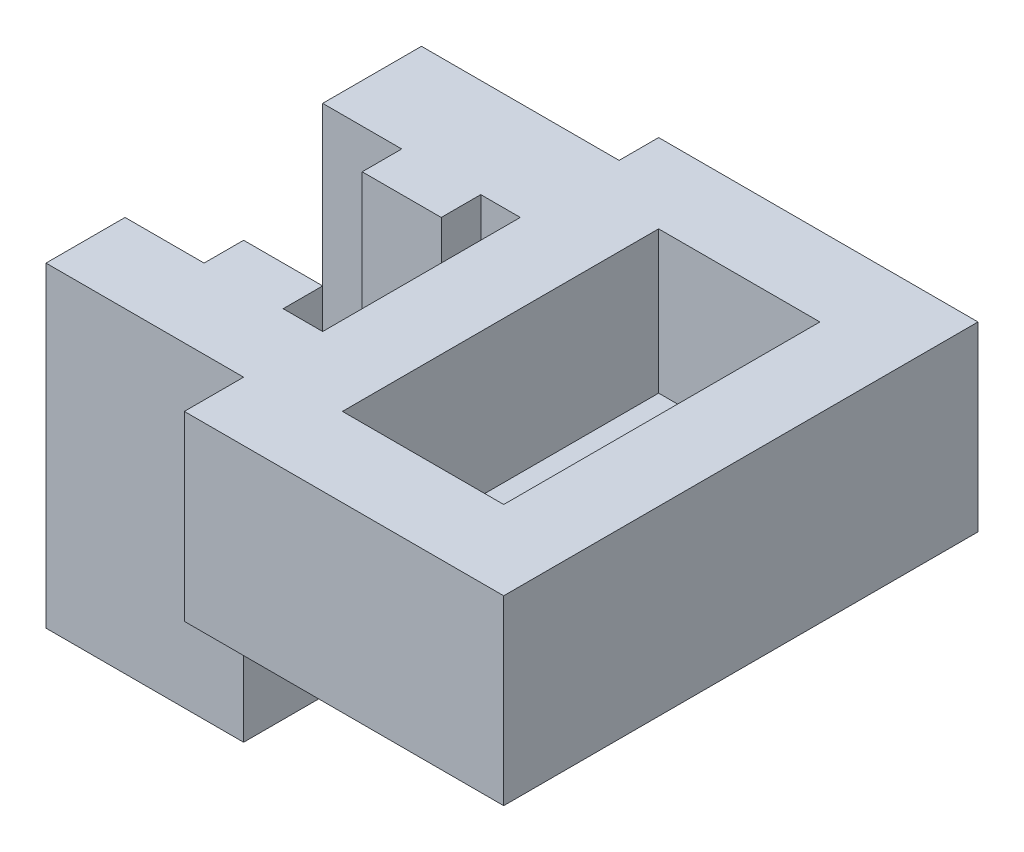
ISO-10303-21;
HEADER;
FILE_DESCRIPTION(('STEP AP214'),'2;1');
FILE_NAME('part.step','',(''),(''),'','','');
FILE_SCHEMA(('AUTOMOTIVE_DESIGN { 1 0 10303 214 1 1 1 1 }'));
ENDSEC;
DATA;
#1=APPLICATION_CONTEXT('core data for automotive mechanical design processes');
#2=APPLICATION_PROTOCOL_DEFINITION('international standard','automotive_design',2000,#1);
#3=PRODUCT_CONTEXT('',#1,'mechanical');
#4=PRODUCT('Part','Part','',(#3));
#5=PRODUCT_RELATED_PRODUCT_CATEGORY('part','',(#4));
#6=PRODUCT_DEFINITION_FORMATION('','',#4);
#7=PRODUCT_DEFINITION_CONTEXT('part definition',#1,'design');
#8=PRODUCT_DEFINITION('design','',#6,#7);
#9=PRODUCT_DEFINITION_SHAPE('','',#8);
#10=(LENGTH_UNIT() NAMED_UNIT(*) SI_UNIT(.MILLI.,.METRE.));
#11=(NAMED_UNIT(*) PLANE_ANGLE_UNIT() SI_UNIT($,.RADIAN.));
#12=(NAMED_UNIT(*) SI_UNIT($,.STERADIAN.) SOLID_ANGLE_UNIT());
#13=UNCERTAINTY_MEASURE_WITH_UNIT(LENGTH_MEASURE(1.E-05),#10,'distance_accuracy_value','');
#14=(GEOMETRIC_REPRESENTATION_CONTEXT(3) GLOBAL_UNCERTAINTY_ASSIGNED_CONTEXT((#13)) GLOBAL_UNIT_ASSIGNED_CONTEXT((#10,
#11,#12)) REPRESENTATION_CONTEXT('',''));
#15=CARTESIAN_POINT('',(0.,0.,0.));
#16=DIRECTION('',(0.,0.,1.));
#17=DIRECTION('',(1.,0.,0.));
#18=AXIS2_PLACEMENT_3D('',#15,#16,#17);
#19=CARTESIAN_POINT('',(-20.2,18.,-30.));
#20=DIRECTION('',(1.,0.,0.));
#21=DIRECTION('',(0.,0.,1.));
#22=AXIS2_PLACEMENT_3D('',#19,#20,#21);
#23=PLANE('',#22);
#24=DIRECTION('',(0.,1.,0.));
#25=VECTOR('',#24,1.);
#26=CARTESIAN_POINT('',(-20.2,-22.,12.5));
#27=LINE('',#26,#25);
#28=CARTESIAN_POINT('',(-20.2,-5.,12.5));
#29=VERTEX_POINT('',#28);
#30=CARTESIAN_POINT('',(-20.2,18.,12.5));
#31=VERTEX_POINT('',#30);
#32=EDGE_CURVE('E291',#29,#31,#27,.T.);
#33=ORIENTED_EDGE('',*,*,#32,.T.);
#34=DIRECTION('',(0.,0.,-1.));
#35=VECTOR('',#34,1.);
#36=CARTESIAN_POINT('',(-20.2,18.,-30.));
#37=LINE('',#36,#35);
#38=CARTESIAN_POINT('',(-20.2,18.,-12.5));
#39=VERTEX_POINT('',#38);
#40=EDGE_CURVE('E399',#31,#39,#37,.T.);
#41=ORIENTED_EDGE('',*,*,#40,.T.);
#42=DIRECTION('',(0.,1.,0.));
#43=VECTOR('',#42,1.);
#44=CARTESIAN_POINT('',(-20.2,-22.,-12.5));
#45=LINE('',#44,#43);
#46=CARTESIAN_POINT('',(-20.2,-5.,-12.5));
#47=VERTEX_POINT('',#46);
#48=EDGE_CURVE('E316',#47,#39,#45,.T.);
#49=ORIENTED_EDGE('',*,*,#48,.F.);
#50=DIRECTION('',(0.,0.,1.));
#51=VECTOR('',#50,1.);
#52=CARTESIAN_POINT('',(-20.2,-5.,30.));
#53=LINE('',#52,#51);
#54=EDGE_CURVE('E508',#47,#29,#53,.T.);
#55=ORIENTED_EDGE('',*,*,#54,.T.);
#56=EDGE_LOOP('',(#33,#41,#49,#55));
#57=FACE_BOUND('',#56,.T.);
#58=ADVANCED_FACE('F41',(#57),#23,.F.);
#59=CARTESIAN_POINT('',(-20.2,18.,-25.));
#60=VERTEX_POINT('',#59);
#61=CARTESIAN_POINT('',(-20.2,18.,-30.));
#62=VERTEX_POINT('',#61);
#63=EDGE_CURVE('E394',#60,#62,#37,.T.);
#64=ORIENTED_EDGE('',*,*,#63,.T.);
#65=DIRECTION('',(0.,-1.,0.));
#66=VECTOR('',#65,1.);
#67=CARTESIAN_POINT('',(-20.2,18.,-30.));
#68=LINE('',#67,#66);
#69=CARTESIAN_POINT('',(-20.2,-5.,-30.));
#70=VERTEX_POINT('',#69);
#71=EDGE_CURVE('E405',#62,#70,#68,.T.);
#72=ORIENTED_EDGE('',*,*,#71,.T.);
#73=CARTESIAN_POINT('',(-20.2,-5.,-25.));
#74=VERTEX_POINT('',#73);
#75=EDGE_CURVE('E342',#70,#74,#53,.T.);
#76=ORIENTED_EDGE('',*,*,#75,.T.);
#77=DIRECTION('',(0.,1.,0.));
#78=VECTOR('',#77,1.);
#79=CARTESIAN_POINT('',(-20.2,18.,-25.));
#80=LINE('',#79,#78);
#81=EDGE_CURVE('E223',#74,#60,#80,.T.);
#82=ORIENTED_EDGE('',*,*,#81,.T.);
#83=EDGE_LOOP('',(#64,#72,#76,#82));
#84=FACE_BOUND('',#83,.T.);
#85=ADVANCED_FACE('F447',(#84),#23,.F.);
#86=CARTESIAN_POINT('',(0.,18.,0.));
#87=DIRECTION('',(0.,1.,0.));
#88=DIRECTION('',(0.,0.,-1.));
#89=AXIS2_PLACEMENT_3D('',#86,#87,#88);
#90=PLANE('',#89);
#91=DIRECTION('',(-1.,0.,0.));
#92=VECTOR('',#91,1.);
#93=CARTESIAN_POINT('',(-45.2,18.,-25.));
#94=LINE('',#93,#92);
#95=CARTESIAN_POINT('',(-45.2,18.,-25.));
#96=VERTEX_POINT('',#95);
#97=EDGE_CURVE('E56',#60,#96,#94,.T.);
#98=ORIENTED_EDGE('',*,*,#97,.T.);
#99=DIRECTION('',(0.,0.,-1.));
#100=VECTOR('',#99,1.);
#101=CARTESIAN_POINT('',(-45.2,18.,-22.5));
#102=LINE('',#101,#100);
#103=CARTESIAN_POINT('',(-45.2,18.,-12.5));
#104=VERTEX_POINT('',#103);
#105=EDGE_CURVE('E237',#104,#96,#102,.T.);
#106=ORIENTED_EDGE('',*,*,#105,.F.);
#107=DIRECTION('',(-1.,0.,0.));
#108=VECTOR('',#107,1.);
#109=CARTESIAN_POINT('',(-45.2,18.,-12.5));
#110=LINE('',#109,#108);
#111=CARTESIAN_POINT('',(-35.2,18.,-12.5));
#112=VERTEX_POINT('',#111);
#113=EDGE_CURVE('E318',#112,#104,#110,.T.);
#114=ORIENTED_EDGE('',*,*,#113,.F.);
#115=DIRECTION('',(0.,0.,-1.));
#116=VECTOR('',#115,1.);
#117=CARTESIAN_POINT('',(-35.2,18.,-12.5));
#118=LINE('',#117,#116);
#119=CARTESIAN_POINT('',(-35.2,18.,-7.5));
#120=VERTEX_POINT('',#119);
#121=EDGE_CURVE('E322',#120,#112,#118,.T.);
#122=ORIENTED_EDGE('',*,*,#121,.F.);
#123=DIRECTION('',(-1.,0.,0.));
#124=VECTOR('',#123,1.);
#125=CARTESIAN_POINT('',(-35.2,18.,-7.5));
#126=LINE('',#125,#124);
#127=CARTESIAN_POINT('',(-25.2,18.,-7.5));
#128=VERTEX_POINT('',#127);
#129=EDGE_CURVE('E325',#128,#120,#126,.T.);
#130=ORIENTED_EDGE('',*,*,#129,.F.);
#131=DIRECTION('',(0.,0.,1.));
#132=VECTOR('',#131,1.);
#133=CARTESIAN_POINT('',(-25.2,18.,-7.5));
#134=LINE('',#133,#132);
#135=CARTESIAN_POINT('',(-25.2,18.,-12.5));
#136=VERTEX_POINT('',#135);
#137=EDGE_CURVE('E328',#136,#128,#134,.T.);
#138=ORIENTED_EDGE('',*,*,#137,.F.);
#139=DIRECTION('',(-1.,0.,0.));
#140=VECTOR('',#139,1.);
#141=CARTESIAN_POINT('',(-25.2,18.,-12.5));
#142=LINE('',#141,#140);
#143=EDGE_CURVE('E271',#39,#136,#142,.T.);
#144=ORIENTED_EDGE('',*,*,#143,.F.);
#145=ORIENTED_EDGE('',*,*,#40,.F.);
#146=DIRECTION('',(1.,0.,0.));
#147=VECTOR('',#146,1.);
#148=CARTESIAN_POINT('',(-25.2,18.,12.5));
#149=LINE('',#148,#147);
#150=CARTESIAN_POINT('',(-25.2,18.,12.5));
#151=VERTEX_POINT('',#150);
#152=EDGE_CURVE('E252',#151,#31,#149,.T.);
#153=ORIENTED_EDGE('',*,*,#152,.F.);
#154=DIRECTION('',(0.,0.,1.));
#155=VECTOR('',#154,1.);
#156=CARTESIAN_POINT('',(-25.2,18.,7.5));
#157=LINE('',#156,#155);
#158=CARTESIAN_POINT('',(-25.2,18.,7.5));
#159=VERTEX_POINT('',#158);
#160=EDGE_CURVE('E283',#159,#151,#157,.T.);
#161=ORIENTED_EDGE('',*,*,#160,.F.);
#162=DIRECTION('',(1.,0.,0.));
#163=VECTOR('',#162,1.);
#164=CARTESIAN_POINT('',(-35.2,18.,7.5));
#165=LINE('',#164,#163);
#166=CARTESIAN_POINT('',(-35.2,18.,7.5));
#167=VERTEX_POINT('',#166);
#168=EDGE_CURVE('E280',#167,#159,#165,.T.);
#169=ORIENTED_EDGE('',*,*,#168,.F.);
#170=DIRECTION('',(0.,0.,-1.));
#171=VECTOR('',#170,1.);
#172=CARTESIAN_POINT('',(-35.2,18.,12.5));
#173=LINE('',#172,#171);
#174=CARTESIAN_POINT('',(-35.2,18.,12.5));
#175=VERTEX_POINT('',#174);
#176=EDGE_CURVE('E277',#175,#167,#173,.T.);
#177=ORIENTED_EDGE('',*,*,#176,.F.);
#178=DIRECTION('',(1.,0.,0.));
#179=VECTOR('',#178,1.);
#180=CARTESIAN_POINT('',(-45.2,18.,12.5));
#181=LINE('',#180,#179);
#182=CARTESIAN_POINT('',(-45.2,18.,12.5));
#183=VERTEX_POINT('',#182);
#184=EDGE_CURVE('E274',#183,#175,#181,.T.);
#185=ORIENTED_EDGE('',*,*,#184,.F.);
#186=DIRECTION('',(0.,0.,-1.));
#187=VECTOR('',#186,1.);
#188=CARTESIAN_POINT('',(-45.2,18.,22.5));
#189=LINE('',#188,#187);
#190=CARTESIAN_POINT('',(-45.2,18.,22.5));
#191=VERTEX_POINT('',#190);
#192=EDGE_CURVE('E270',#191,#183,#189,.T.);
#193=ORIENTED_EDGE('',*,*,#192,.F.);
#194=DIRECTION('',(-1.,0.,0.));
#195=VECTOR('',#194,1.);
#196=CARTESIAN_POINT('',(-20.2,18.,22.5));
#197=LINE('',#196,#195);
#198=CARTESIAN_POINT('',(-20.2,18.,22.5));
#199=VERTEX_POINT('',#198);
#200=EDGE_CURVE('E267',#199,#191,#197,.T.);
#201=ORIENTED_EDGE('',*,*,#200,.F.);
#202=CARTESIAN_POINT('',(-20.2,18.,30.));
#203=VERTEX_POINT('',#202);
#204=EDGE_CURVE('E395',#203,#199,#37,.T.);
#205=ORIENTED_EDGE('',*,*,#204,.F.);
#206=DIRECTION('',(-1.,0.,0.));
#207=VECTOR('',#206,1.);
#208=CARTESIAN_POINT('',(20.2,18.,30.));
#209=LINE('',#208,#207);
#210=CARTESIAN_POINT('',(20.2,18.,30.));
#211=VERTEX_POINT('',#210);
#212=EDGE_CURVE('E391',#211,#203,#209,.T.);
#213=ORIENTED_EDGE('',*,*,#212,.F.);
#214=DIRECTION('',(0.,0.,1.));
#215=VECTOR('',#214,1.);
#216=CARTESIAN_POINT('',(20.2,18.,-30.));
#217=LINE('',#216,#215);
#218=CARTESIAN_POINT('',(20.2,18.,-30.));
#219=VERTEX_POINT('',#218);
#220=EDGE_CURVE('E388',#219,#211,#217,.T.);
#221=ORIENTED_EDGE('',*,*,#220,.F.);
#222=DIRECTION('',(1.,0.,0.));
#223=VECTOR('',#222,1.);
#224=CARTESIAN_POINT('',(20.2,18.,-30.));
#225=LINE('',#224,#223);
#226=EDGE_CURVE('E398',#62,#219,#225,.T.);
#227=ORIENTED_EDGE('',*,*,#226,.F.);
#228=ORIENTED_EDGE('',*,*,#63,.F.);
#229=EDGE_LOOP('',(#98,#106,#114,#122,#130,#138,#144,#145,#153,#161,#169,#177,#185,#193,#201,
#205,#213,#221,#227,#228));
#230=FACE_BOUND('',#229,.T.);
#231=DIRECTION('',(1.,0.,0.));
#232=VECTOR('',#231,1.);
#233=CARTESIAN_POINT('',(10.2,18.,-20.));
#234=LINE('',#233,#232);
#235=CARTESIAN_POINT('',(-10.2,18.,-20.));
#236=VERTEX_POINT('',#235);
#237=CARTESIAN_POINT('',(10.2,18.,-20.));
#238=VERTEX_POINT('',#237);
#239=EDGE_CURVE('E357',#236,#238,#234,.T.);
#240=ORIENTED_EDGE('',*,*,#239,.T.);
#241=DIRECTION('',(0.,0.,1.));
#242=VECTOR('',#241,1.);
#243=CARTESIAN_POINT('',(10.2,18.,-20.));
#244=LINE('',#243,#242);
#245=CARTESIAN_POINT('',(10.2,18.,20.));
#246=VERTEX_POINT('',#245);
#247=EDGE_CURVE('E361',#238,#246,#244,.T.);
#248=ORIENTED_EDGE('',*,*,#247,.T.);
#249=DIRECTION('',(-1.,0.,0.));
#250=VECTOR('',#249,1.);
#251=CARTESIAN_POINT('',(10.2,18.,20.));
#252=LINE('',#251,#250);
#253=CARTESIAN_POINT('',(-10.2,18.,20.));
#254=VERTEX_POINT('',#253);
#255=EDGE_CURVE('E364',#246,#254,#252,.T.);
#256=ORIENTED_EDGE('',*,*,#255,.T.);
#257=DIRECTION('',(0.,0.,-1.));
#258=VECTOR('',#257,1.);
#259=CARTESIAN_POINT('',(-10.2,18.,-20.));
#260=LINE('',#259,#258);
#261=EDGE_CURVE('E354',#254,#236,#260,.T.);
#262=ORIENTED_EDGE('',*,*,#261,.T.);
#263=EDGE_LOOP('',(#240,#248,#256,#262));
#264=FACE_BOUND('',#263,.T.);
#265=ADVANCED_FACE('F454',(#230,#264),#90,.T.);
#266=CARTESIAN_POINT('',(20.2,18.,-30.));
#267=DIRECTION('',(-1.,0.,0.));
#268=DIRECTION('',(0.,0.,-1.));
#269=AXIS2_PLACEMENT_3D('',#266,#267,#268);
#270=PLANE('',#269);
#271=DIRECTION('',(0.,-1.,0.));
#272=VECTOR('',#271,1.);
#273=CARTESIAN_POINT('',(20.2,18.,-30.));
#274=LINE('',#273,#272);
#275=CARTESIAN_POINT('',(20.2,-5.,-30.));
#276=VERTEX_POINT('',#275);
#277=EDGE_CURVE('E402',#219,#276,#274,.T.);
#278=ORIENTED_EDGE('',*,*,#277,.F.);
#279=ORIENTED_EDGE('',*,*,#220,.T.);
#280=DIRECTION('',(0.,-1.,0.));
#281=VECTOR('',#280,1.);
#282=CARTESIAN_POINT('',(20.2,18.,30.));
#283=LINE('',#282,#281);
#284=CARTESIAN_POINT('',(20.2,-5.,30.));
#285=VERTEX_POINT('',#284);
#286=EDGE_CURVE('E411',#211,#285,#283,.T.);
#287=ORIENTED_EDGE('',*,*,#286,.T.);
#288=DIRECTION('',(0.,0.,-1.));
#289=VECTOR('',#288,1.);
#290=CARTESIAN_POINT('',(20.2,-5.,30.));
#291=LINE('',#290,#289);
#292=EDGE_CURVE('E348',#285,#276,#291,.T.);
#293=ORIENTED_EDGE('',*,*,#292,.T.);
#294=EDGE_LOOP('',(#278,#279,#287,#293));
#295=FACE_BOUND('',#294,.T.);
#296=ADVANCED_FACE('F43',(#295),#270,.F.);
#297=CARTESIAN_POINT('',(20.2,18.,30.));
#298=DIRECTION('',(0.,0.,-1.));
#299=DIRECTION('',(1.,0.,0.));
#300=AXIS2_PLACEMENT_3D('',#297,#298,#299);
#301=PLANE('',#300);
#302=ORIENTED_EDGE('',*,*,#286,.F.);
#303=ORIENTED_EDGE('',*,*,#212,.T.);
#304=DIRECTION('',(0.,-1.,0.));
#305=VECTOR('',#304,1.);
#306=CARTESIAN_POINT('',(-20.2,18.,30.));
#307=LINE('',#306,#305);
#308=CARTESIAN_POINT('',(-20.2,-5.,30.));
#309=VERTEX_POINT('',#308);
#310=EDGE_CURVE('E408',#203,#309,#307,.T.);
#311=ORIENTED_EDGE('',*,*,#310,.T.);
#312=DIRECTION('',(1.,0.,0.));
#313=VECTOR('',#312,1.);
#314=CARTESIAN_POINT('',(20.2,-5.,30.));
#315=LINE('',#314,#313);
#316=EDGE_CURVE('E345',#309,#285,#315,.T.);
#317=ORIENTED_EDGE('',*,*,#316,.T.);
#318=EDGE_LOOP('',(#302,#303,#311,#317));
#319=FACE_BOUND('',#318,.T.);
#320=ADVANCED_FACE('F460',(#319),#301,.F.);
#321=CARTESIAN_POINT('',(-20.2,-5.,22.5));
#322=VERTEX_POINT('',#321);
#323=EDGE_CURVE('E289',#322,#309,#53,.T.);
#324=ORIENTED_EDGE('',*,*,#323,.T.);
#325=ORIENTED_EDGE('',*,*,#310,.F.);
#326=ORIENTED_EDGE('',*,*,#204,.T.);
#327=DIRECTION('',(0.,1.,0.));
#328=VECTOR('',#327,1.);
#329=CARTESIAN_POINT('',(-20.2,-22.,22.5));
#330=LINE('',#329,#328);
#331=EDGE_CURVE('E304',#322,#199,#330,.T.);
#332=ORIENTED_EDGE('',*,*,#331,.F.);
#333=EDGE_LOOP('',(#324,#325,#326,#332));
#334=FACE_BOUND('',#333,.T.);
#335=ADVANCED_FACE('F450',(#334),#23,.F.);
#336=CARTESIAN_POINT('',(20.2,18.,-30.));
#337=DIRECTION('',(0.,0.,1.));
#338=DIRECTION('',(-1.,0.,0.));
#339=AXIS2_PLACEMENT_3D('',#336,#337,#338);
#340=PLANE('',#339);
#341=ORIENTED_EDGE('',*,*,#71,.F.);
#342=ORIENTED_EDGE('',*,*,#226,.T.);
#343=ORIENTED_EDGE('',*,*,#277,.T.);
#344=DIRECTION('',(-1.,0.,0.));
#345=VECTOR('',#344,1.);
#346=CARTESIAN_POINT('',(20.2,-5.,-30.));
#347=LINE('',#346,#345);
#348=EDGE_CURVE('E351',#276,#70,#347,.T.);
#349=ORIENTED_EDGE('',*,*,#348,.T.);
#350=EDGE_LOOP('',(#341,#342,#343,#349));
#351=FACE_BOUND('',#350,.T.);
#352=ADVANCED_FACE('F459',(#351),#340,.F.);
#353=CARTESIAN_POINT('',(-10.2,18.,-20.));
#354=DIRECTION('',(1.,0.,0.));
#355=DIRECTION('',(0.,0.,1.));
#356=AXIS2_PLACEMENT_3D('',#353,#354,#355);
#357=PLANE('',#356);
#358=DIRECTION('',(0.,0.,-1.));
#359=VECTOR('',#358,1.);
#360=CARTESIAN_POINT('',(-10.2,0.,-20.));
#361=LINE('',#360,#359);
#362=CARTESIAN_POINT('',(-10.2,0.,20.));
#363=VERTEX_POINT('',#362);
#364=CARTESIAN_POINT('',(-10.2,0.,-20.));
#365=VERTEX_POINT('',#364);
#366=EDGE_CURVE('E353',#363,#365,#361,.T.);
#367=ORIENTED_EDGE('',*,*,#366,.T.);
#368=DIRECTION('',(0.,-1.,0.));
#369=VECTOR('',#368,1.);
#370=CARTESIAN_POINT('',(-10.2,18.,-20.));
#371=LINE('',#370,#369);
#372=EDGE_CURVE('E385',#236,#365,#371,.T.);
#373=ORIENTED_EDGE('',*,*,#372,.F.);
#374=ORIENTED_EDGE('',*,*,#261,.F.);
#375=DIRECTION('',(0.,-1.,0.));
#376=VECTOR('',#375,1.);
#377=CARTESIAN_POINT('',(-10.2,18.,20.));
#378=LINE('',#377,#376);
#379=EDGE_CURVE('E367',#254,#363,#378,.T.);
#380=ORIENTED_EDGE('',*,*,#379,.T.);
#381=EDGE_LOOP('',(#367,#373,#374,#380));
#382=FACE_BOUND('',#381,.T.);
#383=ADVANCED_FACE('F466',(#382),#357,.T.);
#384=CARTESIAN_POINT('',(10.2,18.,-20.));
#385=DIRECTION('',(0.,0.,1.));
#386=DIRECTION('',(-1.,0.,0.));
#387=AXIS2_PLACEMENT_3D('',#384,#385,#386);
#388=PLANE('',#387);
#389=DIRECTION('',(1.,0.,0.));
#390=VECTOR('',#389,1.);
#391=CARTESIAN_POINT('',(10.2,0.,-20.));
#392=LINE('',#391,#390);
#393=CARTESIAN_POINT('',(10.2,0.,-20.));
#394=VERTEX_POINT('',#393);
#395=EDGE_CURVE('E370',#365,#394,#392,.T.);
#396=ORIENTED_EDGE('',*,*,#395,.T.);
#397=DIRECTION('',(0.,-1.,0.));
#398=VECTOR('',#397,1.);
#399=CARTESIAN_POINT('',(10.2,18.,-20.));
#400=LINE('',#399,#398);
#401=EDGE_CURVE('E382',#238,#394,#400,.T.);
#402=ORIENTED_EDGE('',*,*,#401,.F.);
#403=ORIENTED_EDGE('',*,*,#239,.F.);
#404=ORIENTED_EDGE('',*,*,#372,.T.);
#405=EDGE_LOOP('',(#396,#402,#403,#404));
#406=FACE_BOUND('',#405,.T.);
#407=ADVANCED_FACE('F607',(#406),#388,.T.);
#408=CARTESIAN_POINT('',(10.2,18.,-20.));
#409=DIRECTION('',(-1.,0.,0.));
#410=DIRECTION('',(0.,0.,-1.));
#411=AXIS2_PLACEMENT_3D('',#408,#409,#410);
#412=PLANE('',#411);
#413=DIRECTION('',(0.,0.,1.));
#414=VECTOR('',#413,1.);
#415=CARTESIAN_POINT('',(10.2,0.,-20.));
#416=LINE('',#415,#414);
#417=CARTESIAN_POINT('',(10.2,0.,20.));
#418=VERTEX_POINT('',#417);
#419=EDGE_CURVE('E373',#394,#418,#416,.T.);
#420=ORIENTED_EDGE('',*,*,#419,.T.);
#421=DIRECTION('',(0.,-1.,0.));
#422=VECTOR('',#421,1.);
#423=CARTESIAN_POINT('',(10.2,18.,20.));
#424=LINE('',#423,#422);
#425=EDGE_CURVE('E379',#246,#418,#424,.T.);
#426=ORIENTED_EDGE('',*,*,#425,.F.);
#427=ORIENTED_EDGE('',*,*,#247,.F.);
#428=ORIENTED_EDGE('',*,*,#401,.T.);
#429=EDGE_LOOP('',(#420,#426,#427,#428));
#430=FACE_BOUND('',#429,.T.);
#431=ADVANCED_FACE('F603',(#430),#412,.T.);
#432=CARTESIAN_POINT('',(10.2,18.,20.));
#433=DIRECTION('',(0.,0.,-1.));
#434=DIRECTION('',(1.,0.,0.));
#435=AXIS2_PLACEMENT_3D('',#432,#433,#434);
#436=PLANE('',#435);
#437=DIRECTION('',(-1.,0.,0.));
#438=VECTOR('',#437,1.);
#439=CARTESIAN_POINT('',(10.2,0.,20.));
#440=LINE('',#439,#438);
#441=EDGE_CURVE('E358',#418,#363,#440,.T.);
#442=ORIENTED_EDGE('',*,*,#441,.T.);
#443=ORIENTED_EDGE('',*,*,#379,.F.);
#444=ORIENTED_EDGE('',*,*,#255,.F.);
#445=ORIENTED_EDGE('',*,*,#425,.T.);
#446=EDGE_LOOP('',(#442,#443,#444,#445));
#447=FACE_BOUND('',#446,.T.);
#448=ADVANCED_FACE('F599',(#447),#436,.T.);
#449=CARTESIAN_POINT('',(0.,0.,0.));
#450=DIRECTION('',(0.,-1.,0.));
#451=DIRECTION('',(0.,0.,1.));
#452=AXIS2_PLACEMENT_3D('',#449,#450,#451);
#453=PLANE('',#452);
#454=ORIENTED_EDGE('',*,*,#441,.F.);
#455=ORIENTED_EDGE('',*,*,#419,.F.);
#456=ORIENTED_EDGE('',*,*,#395,.F.);
#457=ORIENTED_EDGE('',*,*,#366,.F.);
#458=EDGE_LOOP('',(#454,#455,#456,#457));
#459=FACE_BOUND('',#458,.T.);
#460=ADVANCED_FACE('F596',(#459),#453,.F.);
#461=CARTESIAN_POINT('',(0.,-5.,0.));
#462=DIRECTION('',(0.,-1.,0.));
#463=DIRECTION('',(0.,0.,1.));
#464=AXIS2_PLACEMENT_3D('',#461,#462,#463);
#465=PLANE('',#464);
#466=ORIENTED_EDGE('',*,*,#75,.F.);
#467=ORIENTED_EDGE('',*,*,#348,.F.);
#468=ORIENTED_EDGE('',*,*,#292,.F.);
#469=ORIENTED_EDGE('',*,*,#316,.F.);
#470=ORIENTED_EDGE('',*,*,#323,.F.);
#471=EDGE_CURVE('E474',#29,#322,#53,.T.);
#472=ORIENTED_EDGE('',*,*,#471,.F.);
#473=ORIENTED_EDGE('',*,*,#54,.F.);
#474=EDGE_CURVE('E346',#74,#47,#53,.T.);
#475=ORIENTED_EDGE('',*,*,#474,.F.);
#476=EDGE_LOOP('',(#466,#467,#468,#469,#470,#472,#473,#475));
#477=FACE_BOUND('',#476,.T.);
#478=ADVANCED_FACE('F477',(#477),#465,.T.);
#479=CARTESIAN_POINT('',(-20.2,-22.,-12.5));
#480=DIRECTION('',(1.,0.,0.));
#481=DIRECTION('',(0.,0.,1.));
#482=AXIS2_PLACEMENT_3D('',#479,#480,#481);
#483=PLANE('',#482);
#484=ORIENTED_EDGE('',*,*,#474,.T.);
#485=CARTESIAN_POINT('',(-20.2,-22.,-12.5));
#486=VERTEX_POINT('',#485);
#487=EDGE_CURVE('E247',#486,#47,#45,.T.);
#488=ORIENTED_EDGE('',*,*,#487,.F.);
#489=DIRECTION('',(0.,0.,1.));
#490=VECTOR('',#489,1.);
#491=CARTESIAN_POINT('',(-20.2,-22.,-12.5));
#492=LINE('',#491,#490);
#493=CARTESIAN_POINT('',(-20.2,-22.,-25.));
#494=VERTEX_POINT('',#493);
#495=EDGE_CURVE('E233',#494,#486,#492,.T.);
#496=ORIENTED_EDGE('',*,*,#495,.F.);
#497=EDGE_CURVE('E64',#494,#74,#80,.T.);
#498=ORIENTED_EDGE('',*,*,#497,.T.);
#499=EDGE_LOOP('',(#484,#488,#496,#498));
#500=FACE_BOUND('',#499,.T.);
#501=ADVANCED_FACE('F566',(#500),#483,.T.);
#502=CARTESIAN_POINT('',(-25.2,-22.,-12.5));
#503=DIRECTION('',(0.,0.,1.));
#504=DIRECTION('',(-1.,0.,0.));
#505=AXIS2_PLACEMENT_3D('',#502,#503,#504);
#506=PLANE('',#505);
#507=ORIENTED_EDGE('',*,*,#143,.T.);
#508=DIRECTION('',(0.,1.,0.));
#509=VECTOR('',#508,1.);
#510=CARTESIAN_POINT('',(-25.2,-22.,-12.5));
#511=LINE('',#510,#509);
#512=CARTESIAN_POINT('',(-25.2,-22.,-12.5));
#513=VERTEX_POINT('',#512);
#514=EDGE_CURVE('E305',#513,#136,#511,.T.);
#515=ORIENTED_EDGE('',*,*,#514,.F.);
#516=DIRECTION('',(-1.,0.,0.));
#517=VECTOR('',#516,1.);
#518=CARTESIAN_POINT('',(-25.2,-22.,-12.5));
#519=LINE('',#518,#517);
#520=EDGE_CURVE('E319',#486,#513,#519,.T.);
#521=ORIENTED_EDGE('',*,*,#520,.F.);
#522=ORIENTED_EDGE('',*,*,#487,.T.);
#523=ORIENTED_EDGE('',*,*,#48,.T.);
#524=EDGE_LOOP('',(#507,#515,#521,#522,#523));
#525=FACE_BOUND('',#524,.T.);
#526=ADVANCED_FACE('F496',(#525),#506,.T.);
#527=CARTESIAN_POINT('',(-45.2,-22.,-22.5));
#528=DIRECTION('',(-1.,0.,0.));
#529=DIRECTION('',(0.,0.,-1.));
#530=AXIS2_PLACEMENT_3D('',#527,#528,#529);
#531=PLANE('',#530);
#532=ORIENTED_EDGE('',*,*,#105,.T.);
#533=DIRECTION('',(0.,-1.,0.));
#534=VECTOR('',#533,1.);
#535=CARTESIAN_POINT('',(-45.2,18.,-25.));
#536=LINE('',#535,#534);
#537=CARTESIAN_POINT('',(-45.2,-22.,-25.));
#538=VERTEX_POINT('',#537);
#539=EDGE_CURVE('E219',#96,#538,#536,.T.);
#540=ORIENTED_EDGE('',*,*,#539,.T.);
#541=DIRECTION('',(0.,0.,-1.));
#542=VECTOR('',#541,1.);
#543=CARTESIAN_POINT('',(-45.2,-22.,-22.5));
#544=LINE('',#543,#542);
#545=CARTESIAN_POINT('',(-45.2,-22.,-12.5));
#546=VERTEX_POINT('',#545);
#547=EDGE_CURVE('E226',#546,#538,#544,.T.);
#548=ORIENTED_EDGE('',*,*,#547,.F.);
#549=DIRECTION('',(0.,1.,0.));
#550=VECTOR('',#549,1.);
#551=CARTESIAN_POINT('',(-45.2,-22.,-12.5));
#552=LINE('',#551,#550);
#553=EDGE_CURVE('E313',#546,#104,#552,.T.);
#554=ORIENTED_EDGE('',*,*,#553,.T.);
#555=EDGE_LOOP('',(#532,#540,#548,#554));
#556=FACE_BOUND('',#555,.T.);
#557=ADVANCED_FACE('F235',(#556),#531,.T.);
#558=CARTESIAN_POINT('',(-45.2,-22.,-12.5));
#559=DIRECTION('',(0.,0.,1.));
#560=DIRECTION('',(-1.,0.,0.));
#561=AXIS2_PLACEMENT_3D('',#558,#559,#560);
#562=PLANE('',#561);
#563=ORIENTED_EDGE('',*,*,#113,.T.);
#564=ORIENTED_EDGE('',*,*,#553,.F.);
#565=DIRECTION('',(-1.,0.,0.));
#566=VECTOR('',#565,1.);
#567=CARTESIAN_POINT('',(-45.2,-22.,-12.5));
#568=LINE('',#567,#566);
#569=CARTESIAN_POINT('',(-35.2,-22.,-12.5));
#570=VERTEX_POINT('',#569);
#571=EDGE_CURVE('E230',#570,#546,#568,.T.);
#572=ORIENTED_EDGE('',*,*,#571,.F.);
#573=DIRECTION('',(0.,1.,0.));
#574=VECTOR('',#573,1.);
#575=CARTESIAN_POINT('',(-35.2,-22.,-12.5));
#576=LINE('',#575,#574);
#577=EDGE_CURVE('E311',#570,#112,#576,.T.);
#578=ORIENTED_EDGE('',*,*,#577,.T.);
#579=EDGE_LOOP('',(#563,#564,#572,#578));
#580=FACE_BOUND('',#579,.T.);
#581=ADVANCED_FACE('F578',(#580),#562,.T.);
#582=CARTESIAN_POINT('',(-35.2,-22.,-12.5));
#583=DIRECTION('',(-1.,0.,0.));
#584=DIRECTION('',(0.,0.,-1.));
#585=AXIS2_PLACEMENT_3D('',#582,#583,#584);
#586=PLANE('',#585);
#587=ORIENTED_EDGE('',*,*,#121,.T.);
#588=ORIENTED_EDGE('',*,*,#577,.F.);
#589=DIRECTION('',(0.,0.,-1.));
#590=VECTOR('',#589,1.);
#591=CARTESIAN_POINT('',(-35.2,-22.,-12.5));
#592=LINE('',#591,#590);
#593=CARTESIAN_POINT('',(-35.2,-22.,-7.5));
#594=VERTEX_POINT('',#593);
#595=EDGE_CURVE('E335',#594,#570,#592,.T.);
#596=ORIENTED_EDGE('',*,*,#595,.F.);
#597=DIRECTION('',(0.,1.,0.));
#598=VECTOR('',#597,1.);
#599=CARTESIAN_POINT('',(-35.2,-22.,-7.5));
#600=LINE('',#599,#598);
#601=EDGE_CURVE('E309',#594,#120,#600,.T.);
#602=ORIENTED_EDGE('',*,*,#601,.T.);
#603=EDGE_LOOP('',(#587,#588,#596,#602));
#604=FACE_BOUND('',#603,.T.);
#605=ADVANCED_FACE('F574',(#604),#586,.T.);
#606=CARTESIAN_POINT('',(-35.2,-22.,-7.5));
#607=DIRECTION('',(0.,0.,1.));
#608=DIRECTION('',(-1.,0.,0.));
#609=AXIS2_PLACEMENT_3D('',#606,#607,#608);
#610=PLANE('',#609);
#611=ORIENTED_EDGE('',*,*,#129,.T.);
#612=ORIENTED_EDGE('',*,*,#601,.F.);
#613=DIRECTION('',(-1.,0.,0.));
#614=VECTOR('',#613,1.);
#615=CARTESIAN_POINT('',(-35.2,-22.,-7.5));
#616=LINE('',#615,#614);
#617=CARTESIAN_POINT('',(-25.2,-22.,-7.5));
#618=VERTEX_POINT('',#617);
#619=EDGE_CURVE('E337',#618,#594,#616,.T.);
#620=ORIENTED_EDGE('',*,*,#619,.F.);
#621=DIRECTION('',(0.,1.,0.));
#622=VECTOR('',#621,1.);
#623=CARTESIAN_POINT('',(-25.2,-22.,-7.5));
#624=LINE('',#623,#622);
#625=EDGE_CURVE('E307',#618,#128,#624,.T.);
#626=ORIENTED_EDGE('',*,*,#625,.T.);
#627=EDGE_LOOP('',(#611,#612,#620,#626));
#628=FACE_BOUND('',#627,.T.);
#629=ADVANCED_FACE('F570',(#628),#610,.T.);
#630=CARTESIAN_POINT('',(-25.2,-22.,-7.5));
#631=DIRECTION('',(1.,0.,0.));
#632=DIRECTION('',(0.,0.,1.));
#633=AXIS2_PLACEMENT_3D('',#630,#631,#632);
#634=PLANE('',#633);
#635=ORIENTED_EDGE('',*,*,#137,.T.);
#636=ORIENTED_EDGE('',*,*,#625,.F.);
#637=DIRECTION('',(0.,0.,1.));
#638=VECTOR('',#637,1.);
#639=CARTESIAN_POINT('',(-25.2,-22.,-7.5));
#640=LINE('',#639,#638);
#641=EDGE_CURVE('E339',#513,#618,#640,.T.);
#642=ORIENTED_EDGE('',*,*,#641,.F.);
#643=ORIENTED_EDGE('',*,*,#514,.T.);
#644=EDGE_LOOP('',(#635,#636,#642,#643));
#645=FACE_BOUND('',#644,.T.);
#646=ADVANCED_FACE('F567',(#645),#634,.T.);
#647=CARTESIAN_POINT('',(0.,-22.,0.));
#648=DIRECTION('',(0.,-1.,0.));
#649=DIRECTION('',(0.,0.,1.));
#650=AXIS2_PLACEMENT_3D('',#647,#648,#649);
#651=PLANE('',#650);
#652=ORIENTED_EDGE('',*,*,#520,.T.);
#653=ORIENTED_EDGE('',*,*,#641,.T.);
#654=ORIENTED_EDGE('',*,*,#619,.T.);
#655=ORIENTED_EDGE('',*,*,#595,.T.);
#656=ORIENTED_EDGE('',*,*,#571,.T.);
#657=ORIENTED_EDGE('',*,*,#547,.T.);
#658=DIRECTION('',(1.,0.,0.));
#659=VECTOR('',#658,1.);
#660=CARTESIAN_POINT('',(-45.2,-22.,-25.));
#661=LINE('',#660,#659);
#662=EDGE_CURVE('E214',#538,#494,#661,.T.);
#663=ORIENTED_EDGE('',*,*,#662,.T.);
#664=ORIENTED_EDGE('',*,*,#495,.T.);
#665=EDGE_LOOP('',(#652,#653,#654,#655,#656,#657,#663,#664));
#666=FACE_BOUND('',#665,.T.);
#667=ADVANCED_FACE('F228',(#666),#651,.T.);
#668=CARTESIAN_POINT('',(-20.2,-22.,12.5));
#669=DIRECTION('',(1.,0.,0.));
#670=DIRECTION('',(0.,0.,1.));
#671=AXIS2_PLACEMENT_3D('',#668,#669,#670);
#672=PLANE('',#671);
#673=ORIENTED_EDGE('',*,*,#471,.T.);
#674=CARTESIAN_POINT('',(-20.2,-22.,22.5));
#675=VERTEX_POINT('',#674);
#676=EDGE_CURVE('E266',#675,#322,#330,.T.);
#677=ORIENTED_EDGE('',*,*,#676,.F.);
#678=DIRECTION('',(0.,0.,1.));
#679=VECTOR('',#678,1.);
#680=CARTESIAN_POINT('',(-20.2,-22.,12.5));
#681=LINE('',#680,#679);
#682=CARTESIAN_POINT('',(-20.2,-22.,12.5));
#683=VERTEX_POINT('',#682);
#684=EDGE_CURVE('E248',#683,#675,#681,.T.);
#685=ORIENTED_EDGE('',*,*,#684,.F.);
#686=EDGE_CURVE('E287',#683,#29,#27,.T.);
#687=ORIENTED_EDGE('',*,*,#686,.T.);
#688=EDGE_LOOP('',(#673,#677,#685,#687));
#689=FACE_BOUND('',#688,.T.);
#690=ADVANCED_FACE('F510',(#689),#672,.T.);
#691=CARTESIAN_POINT('',(-25.2,-22.,12.5));
#692=DIRECTION('',(0.,0.,-1.));
#693=DIRECTION('',(1.,0.,0.));
#694=AXIS2_PLACEMENT_3D('',#691,#692,#693);
#695=PLANE('',#694);
#696=ORIENTED_EDGE('',*,*,#152,.T.);
#697=ORIENTED_EDGE('',*,*,#32,.F.);
#698=ORIENTED_EDGE('',*,*,#686,.F.);
#699=DIRECTION('',(1.,0.,0.));
#700=VECTOR('',#699,1.);
#701=CARTESIAN_POINT('',(-25.2,-22.,12.5));
#702=LINE('',#701,#700);
#703=CARTESIAN_POINT('',(-25.2,-22.,12.5));
#704=VERTEX_POINT('',#703);
#705=EDGE_CURVE('E264',#704,#683,#702,.T.);
#706=ORIENTED_EDGE('',*,*,#705,.F.);
#707=DIRECTION('',(0.,1.,0.));
#708=VECTOR('',#707,1.);
#709=CARTESIAN_POINT('',(-25.2,-22.,12.5));
#710=LINE('',#709,#708);
#711=EDGE_CURVE('E290',#704,#151,#710,.T.);
#712=ORIENTED_EDGE('',*,*,#711,.T.);
#713=EDGE_LOOP('',(#696,#697,#698,#706,#712));
#714=FACE_BOUND('',#713,.T.);
#715=ADVANCED_FACE('F515',(#714),#695,.T.);
#716=CARTESIAN_POINT('',(-25.2,-22.,7.5));
#717=DIRECTION('',(1.,0.,0.));
#718=DIRECTION('',(0.,0.,1.));
#719=AXIS2_PLACEMENT_3D('',#716,#717,#718);
#720=PLANE('',#719);
#721=ORIENTED_EDGE('',*,*,#160,.T.);
#722=ORIENTED_EDGE('',*,*,#711,.F.);
#723=DIRECTION('',(0.,0.,1.));
#724=VECTOR('',#723,1.);
#725=CARTESIAN_POINT('',(-25.2,-22.,7.5));
#726=LINE('',#725,#724);
#727=CARTESIAN_POINT('',(-25.2,-22.,7.5));
#728=VERTEX_POINT('',#727);
#729=EDGE_CURVE('E262',#728,#704,#726,.T.);
#730=ORIENTED_EDGE('',*,*,#729,.F.);
#731=DIRECTION('',(0.,1.,0.));
#732=VECTOR('',#731,1.);
#733=CARTESIAN_POINT('',(-25.2,-22.,7.5));
#734=LINE('',#733,#732);
#735=EDGE_CURVE('E293',#728,#159,#734,.T.);
#736=ORIENTED_EDGE('',*,*,#735,.T.);
#737=EDGE_LOOP('',(#721,#722,#730,#736));
#738=FACE_BOUND('',#737,.T.);
#739=ADVANCED_FACE('F521',(#738),#720,.T.);
#740=CARTESIAN_POINT('',(-35.2,-22.,7.5));
#741=DIRECTION('',(0.,0.,-1.));
#742=DIRECTION('',(1.,0.,0.));
#743=AXIS2_PLACEMENT_3D('',#740,#741,#742);
#744=PLANE('',#743);
#745=ORIENTED_EDGE('',*,*,#168,.T.);
#746=ORIENTED_EDGE('',*,*,#735,.F.);
#747=DIRECTION('',(1.,0.,0.));
#748=VECTOR('',#747,1.);
#749=CARTESIAN_POINT('',(-35.2,-22.,7.5));
#750=LINE('',#749,#748);
#751=CARTESIAN_POINT('',(-35.2,-22.,7.5));
#752=VERTEX_POINT('',#751);
#753=EDGE_CURVE('E260',#752,#728,#750,.T.);
#754=ORIENTED_EDGE('',*,*,#753,.F.);
#755=DIRECTION('',(0.,1.,0.));
#756=VECTOR('',#755,1.);
#757=CARTESIAN_POINT('',(-35.2,-22.,7.5));
#758=LINE('',#757,#756);
#759=EDGE_CURVE('E295',#752,#167,#758,.T.);
#760=ORIENTED_EDGE('',*,*,#759,.T.);
#761=EDGE_LOOP('',(#745,#746,#754,#760));
#762=FACE_BOUND('',#761,.T.);
#763=ADVANCED_FACE('F526',(#762),#744,.T.);
#764=CARTESIAN_POINT('',(-35.2,-22.,12.5));
#765=DIRECTION('',(-1.,0.,0.));
#766=DIRECTION('',(0.,0.,-1.));
#767=AXIS2_PLACEMENT_3D('',#764,#765,#766);
#768=PLANE('',#767);
#769=ORIENTED_EDGE('',*,*,#176,.T.);
#770=ORIENTED_EDGE('',*,*,#759,.F.);
#771=DIRECTION('',(0.,0.,-1.));
#772=VECTOR('',#771,1.);
#773=CARTESIAN_POINT('',(-35.2,-22.,12.5));
#774=LINE('',#773,#772);
#775=CARTESIAN_POINT('',(-35.2,-22.,12.5));
#776=VERTEX_POINT('',#775);
#777=EDGE_CURVE('E258',#776,#752,#774,.T.);
#778=ORIENTED_EDGE('',*,*,#777,.F.);
#779=DIRECTION('',(0.,1.,0.));
#780=VECTOR('',#779,1.);
#781=CARTESIAN_POINT('',(-35.2,-22.,12.5));
#782=LINE('',#781,#780);
#783=EDGE_CURVE('E297',#776,#175,#782,.T.);
#784=ORIENTED_EDGE('',*,*,#783,.T.);
#785=EDGE_LOOP('',(#769,#770,#778,#784));
#786=FACE_BOUND('',#785,.T.);
#787=ADVANCED_FACE('F530',(#786),#768,.T.);
#788=CARTESIAN_POINT('',(-45.2,-22.,12.5));
#789=DIRECTION('',(0.,0.,-1.));
#790=DIRECTION('',(1.,0.,0.));
#791=AXIS2_PLACEMENT_3D('',#788,#789,#790);
#792=PLANE('',#791);
#793=ORIENTED_EDGE('',*,*,#184,.T.);
#794=ORIENTED_EDGE('',*,*,#783,.F.);
#795=DIRECTION('',(1.,0.,0.));
#796=VECTOR('',#795,1.);
#797=CARTESIAN_POINT('',(-45.2,-22.,12.5));
#798=LINE('',#797,#796);
#799=CARTESIAN_POINT('',(-45.2,-22.,12.5));
#800=VERTEX_POINT('',#799);
#801=EDGE_CURVE('E256',#800,#776,#798,.T.);
#802=ORIENTED_EDGE('',*,*,#801,.F.);
#803=DIRECTION('',(0.,1.,0.));
#804=VECTOR('',#803,1.);
#805=CARTESIAN_POINT('',(-45.2,-22.,12.5));
#806=LINE('',#805,#804);
#807=EDGE_CURVE('E299',#800,#183,#806,.T.);
#808=ORIENTED_EDGE('',*,*,#807,.T.);
#809=EDGE_LOOP('',(#793,#794,#802,#808));
#810=FACE_BOUND('',#809,.T.);
#811=ADVANCED_FACE('F533',(#810),#792,.T.);
#812=CARTESIAN_POINT('',(-45.2,-22.,22.5));
#813=DIRECTION('',(-1.,0.,0.));
#814=DIRECTION('',(0.,0.,-1.));
#815=AXIS2_PLACEMENT_3D('',#812,#813,#814);
#816=PLANE('',#815);
#817=ORIENTED_EDGE('',*,*,#192,.T.);
#818=ORIENTED_EDGE('',*,*,#807,.F.);
#819=DIRECTION('',(0.,0.,-1.));
#820=VECTOR('',#819,1.);
#821=CARTESIAN_POINT('',(-45.2,-22.,22.5));
#822=LINE('',#821,#820);
#823=CARTESIAN_POINT('',(-45.2,-22.,22.5));
#824=VERTEX_POINT('',#823);
#825=EDGE_CURVE('E254',#824,#800,#822,.T.);
#826=ORIENTED_EDGE('',*,*,#825,.F.);
#827=DIRECTION('',(0.,1.,0.));
#828=VECTOR('',#827,1.);
#829=CARTESIAN_POINT('',(-45.2,-22.,22.5));
#830=LINE('',#829,#828);
#831=EDGE_CURVE('E301',#824,#191,#830,.T.);
#832=ORIENTED_EDGE('',*,*,#831,.T.);
#833=EDGE_LOOP('',(#817,#818,#826,#832));
#834=FACE_BOUND('',#833,.T.);
#835=ADVANCED_FACE('F537',(#834),#816,.T.);
#836=CARTESIAN_POINT('',(-20.2,-22.,22.5));
#837=DIRECTION('',(0.,0.,1.));
#838=DIRECTION('',(-1.,0.,0.));
#839=AXIS2_PLACEMENT_3D('',#836,#837,#838);
#840=PLANE('',#839);
#841=ORIENTED_EDGE('',*,*,#200,.T.);
#842=ORIENTED_EDGE('',*,*,#831,.F.);
#843=DIRECTION('',(-1.,0.,0.));
#844=VECTOR('',#843,1.);
#845=CARTESIAN_POINT('',(-20.2,-22.,22.5));
#846=LINE('',#845,#844);
#847=EDGE_CURVE('E251',#675,#824,#846,.T.);
#848=ORIENTED_EDGE('',*,*,#847,.F.);
#849=ORIENTED_EDGE('',*,*,#676,.T.);
#850=ORIENTED_EDGE('',*,*,#331,.T.);
#851=EDGE_LOOP('',(#841,#842,#848,#849,#850));
#852=FACE_BOUND('',#851,.T.);
#853=ADVANCED_FACE('F488',(#852),#840,.T.);
#854=CARTESIAN_POINT('',(0.,-22.,0.));
#855=DIRECTION('',(0.,1.,0.));
#856=DIRECTION('',(0.,0.,-1.));
#857=AXIS2_PLACEMENT_3D('',#854,#855,#856);
#858=PLANE('',#857);
#859=ORIENTED_EDGE('',*,*,#684,.T.);
#860=ORIENTED_EDGE('',*,*,#847,.T.);
#861=ORIENTED_EDGE('',*,*,#825,.T.);
#862=ORIENTED_EDGE('',*,*,#801,.T.);
#863=ORIENTED_EDGE('',*,*,#777,.T.);
#864=ORIENTED_EDGE('',*,*,#753,.T.);
#865=ORIENTED_EDGE('',*,*,#729,.T.);
#866=ORIENTED_EDGE('',*,*,#705,.T.);
#867=EDGE_LOOP('',(#859,#860,#861,#862,#863,#864,#865,#866));
#868=FACE_BOUND('',#867,.T.);
#869=ADVANCED_FACE('F539',(#868),#858,.F.);
#870=CARTESIAN_POINT('',(0.,0.,-25.));
#871=DIRECTION('',(0.,0.,-1.));
#872=DIRECTION('',(1.,0.,0.));
#873=AXIS2_PLACEMENT_3D('',#870,#871,#872);
#874=PLANE('',#873);
#875=CARTESIAN_POINT('',(-37.2,-17.,-25.));
#876=DIRECTION('',(0.,0.,1.));
#877=DIRECTION('',(1.,0.,0.));
#878=AXIS2_PLACEMENT_3D('',#875,#876,#877);
#879=CIRCLE('',#878,1.5);
#880=CARTESIAN_POINT('',(-35.7,-17.,-25.));
#881=VERTEX_POINT('',#880);
#882=EDGE_CURVE('E938',#881,#881,#879,.T.);
#883=ORIENTED_EDGE('',*,*,#882,.T.);
#884=EDGE_LOOP('',(#883));
#885=FACE_BOUND('',#884,.T.);
#886=CARTESIAN_POINT('',(-37.2,-2.,-25.));
#887=DIRECTION('',(0.,0.,1.));
#888=DIRECTION('',(1.,0.,0.));
#889=AXIS2_PLACEMENT_3D('',#886,#887,#888);
#890=CIRCLE('',#889,1.5);
#891=CARTESIAN_POINT('',(-35.7,-2.,-25.));
#892=VERTEX_POINT('',#891);
#893=EDGE_CURVE('E946',#892,#892,#890,.T.);
#894=ORIENTED_EDGE('',*,*,#893,.T.);
#895=EDGE_LOOP('',(#894));
#896=FACE_BOUND('',#895,.T.);
#897=CARTESIAN_POINT('',(-37.2,13.,-25.));
#898=DIRECTION('',(0.,0.,1.));
#899=DIRECTION('',(1.,0.,0.));
#900=AXIS2_PLACEMENT_3D('',#897,#898,#899);
#901=CIRCLE('',#900,1.5);
#902=CARTESIAN_POINT('',(-35.7,13.,-25.));
#903=VERTEX_POINT('',#902);
#904=EDGE_CURVE('E238',#903,#903,#901,.T.);
#905=ORIENTED_EDGE('',*,*,#904,.T.);
#906=EDGE_LOOP('',(#905));
#907=FACE_BOUND('',#906,.T.);
#908=ORIENTED_EDGE('',*,*,#539,.F.);
#909=ORIENTED_EDGE('',*,*,#97,.F.);
#910=ORIENTED_EDGE('',*,*,#81,.F.);
#911=ORIENTED_EDGE('',*,*,#497,.F.);
#912=ORIENTED_EDGE('',*,*,#662,.F.);
#913=EDGE_LOOP('',(#908,#909,#910,#911,#912));
#914=FACE_BOUND('',#913,.T.);
#915=CARTESIAN_POINT('',(-23.2,13.,-25.));
#916=DIRECTION('',(0.,0.,1.));
#917=DIRECTION('',(1.,0.,0.));
#918=AXIS2_PLACEMENT_3D('',#915,#916,#917);
#919=CIRCLE('',#918,1.5);
#920=CARTESIAN_POINT('',(-21.7,13.,-25.));
#921=VERTEX_POINT('',#920);
#922=EDGE_CURVE('E241',#921,#921,#919,.T.);
#923=ORIENTED_EDGE('',*,*,#922,.T.);
#924=EDGE_LOOP('',(#923));
#925=FACE_BOUND('',#924,.T.);
#926=CARTESIAN_POINT('',(-23.2,-2.,-25.));
#927=DIRECTION('',(0.,0.,1.));
#928=DIRECTION('',(1.,0.,0.));
#929=AXIS2_PLACEMENT_3D('',#926,#927,#928);
#930=CIRCLE('',#929,1.5);
#931=CARTESIAN_POINT('',(-21.7,-2.,-25.));
#932=VERTEX_POINT('',#931);
#933=EDGE_CURVE('E941',#932,#932,#930,.T.);
#934=ORIENTED_EDGE('',*,*,#933,.T.);
#935=EDGE_LOOP('',(#934));
#936=FACE_BOUND('',#935,.T.);
#937=CARTESIAN_POINT('',(-23.2,-17.,-25.));
#938=DIRECTION('',(0.,0.,1.));
#939=DIRECTION('',(1.,0.,0.));
#940=AXIS2_PLACEMENT_3D('',#937,#938,#939);
#941=CIRCLE('',#940,1.5);
#942=CARTESIAN_POINT('',(-21.7,-17.,-25.));
#943=VERTEX_POINT('',#942);
#944=EDGE_CURVE('E936',#943,#943,#941,.T.);
#945=ORIENTED_EDGE('',*,*,#944,.T.);
#946=EDGE_LOOP('',(#945));
#947=FACE_BOUND('',#946,.T.);
#948=ADVANCED_FACE('F216',(#885,#896,#907,#914,#925,#936,#947),#874,.T.);
#949=CARTESIAN_POINT('',(-37.2,13.,-25.));
#950=DIRECTION('',(0.,0.,1.));
#951=DIRECTION('',(-1.,0.,0.));
#952=AXIS2_PLACEMENT_3D('',#949,#950,#951);
#953=CYLINDRICAL_SURFACE('',#952,1.5);
#954=ORIENTED_EDGE('',*,*,#904,.F.);
#955=EDGE_LOOP('',(#954));
#956=FACE_BOUND('',#955,.T.);
#957=CARTESIAN_POINT('',(-37.2,13.,-22.5));
#958=DIRECTION('',(0.,0.,1.));
#959=DIRECTION('',(1.,0.,0.));
#960=AXIS2_PLACEMENT_3D('',#957,#958,#959);
#961=CIRCLE('',#960,1.5);
#962=CARTESIAN_POINT('',(-35.7,13.,-22.5));
#963=VERTEX_POINT('',#962);
#964=EDGE_CURVE('E11',#963,#963,#961,.F.);
#965=ORIENTED_EDGE('',*,*,#964,.F.);
#966=EDGE_LOOP('',(#965));
#967=FACE_BOUND('',#966,.T.);
#968=ADVANCED_FACE('F433',(#956,#967),#953,.F.);
#969=CARTESIAN_POINT('',(-23.2,13.,-25.));
#970=DIRECTION('',(0.,0.,1.));
#971=DIRECTION('',(-1.,0.,0.));
#972=AXIS2_PLACEMENT_3D('',#969,#970,#971);
#973=CYLINDRICAL_SURFACE('',#972,1.5);
#974=ORIENTED_EDGE('',*,*,#922,.F.);
#975=EDGE_LOOP('',(#974));
#976=FACE_BOUND('',#975,.T.);
#977=CARTESIAN_POINT('',(-23.2,13.,-22.5));
#978=DIRECTION('',(0.,0.,1.));
#979=DIRECTION('',(1.,0.,0.));
#980=AXIS2_PLACEMENT_3D('',#977,#978,#979);
#981=CIRCLE('',#980,1.5);
#982=CARTESIAN_POINT('',(-21.7,13.,-22.5));
#983=VERTEX_POINT('',#982);
#984=EDGE_CURVE('E49',#983,#983,#981,.F.);
#985=ORIENTED_EDGE('',*,*,#984,.F.);
#986=EDGE_LOOP('',(#985));
#987=FACE_BOUND('',#986,.T.);
#988=ADVANCED_FACE('F430',(#976,#987),#973,.F.);
#989=CARTESIAN_POINT('',(-37.2,-2.,-25.));
#990=DIRECTION('',(0.,0.,1.));
#991=DIRECTION('',(-1.,0.,0.));
#992=AXIS2_PLACEMENT_3D('',#989,#990,#991);
#993=CYLINDRICAL_SURFACE('',#992,1.5);
#994=ORIENTED_EDGE('',*,*,#893,.F.);
#995=EDGE_LOOP('',(#994));
#996=FACE_BOUND('',#995,.T.);
#997=CARTESIAN_POINT('',(-37.2,-2.,-22.5));
#998=DIRECTION('',(0.,0.,1.));
#999=DIRECTION('',(1.,0.,0.));
#1000=AXIS2_PLACEMENT_3D('',#997,#998,#999);
#1001=CIRCLE('',#1000,1.5);
#1002=CARTESIAN_POINT('',(-35.7,-2.,-22.5));
#1003=VERTEX_POINT('',#1002);
#1004=EDGE_CURVE('E423',#1003,#1003,#1001,.F.);
#1005=ORIENTED_EDGE('',*,*,#1004,.F.);
#1006=EDGE_LOOP('',(#1005));
#1007=FACE_BOUND('',#1006,.T.);
#1008=ADVANCED_FACE('F432',(#996,#1007),#993,.F.);
#1009=CARTESIAN_POINT('',(-23.2,-2.,-25.));
#1010=DIRECTION('',(0.,0.,1.));
#1011=DIRECTION('',(-1.,0.,0.));
#1012=AXIS2_PLACEMENT_3D('',#1009,#1010,#1011);
#1013=CYLINDRICAL_SURFACE('',#1012,1.5);
#1014=ORIENTED_EDGE('',*,*,#933,.F.);
#1015=EDGE_LOOP('',(#1014));
#1016=FACE_BOUND('',#1015,.T.);
#1017=CARTESIAN_POINT('',(-23.2,-2.,-22.5));
#1018=DIRECTION('',(0.,0.,1.));
#1019=DIRECTION('',(1.,0.,0.));
#1020=AXIS2_PLACEMENT_3D('',#1017,#1018,#1019);
#1021=CIRCLE('',#1020,1.5);
#1022=CARTESIAN_POINT('',(-21.7,-2.,-22.5));
#1023=VERTEX_POINT('',#1022);
#1024=EDGE_CURVE('E420',#1023,#1023,#1021,.F.);
#1025=ORIENTED_EDGE('',*,*,#1024,.F.);
#1026=EDGE_LOOP('',(#1025));
#1027=FACE_BOUND('',#1026,.T.);
#1028=ADVANCED_FACE('F440',(#1016,#1027),#1013,.F.);
#1029=CARTESIAN_POINT('',(-37.2,-17.,-25.));
#1030=DIRECTION('',(0.,0.,1.));
#1031=DIRECTION('',(-1.,0.,0.));
#1032=AXIS2_PLACEMENT_3D('',#1029,#1030,#1031);
#1033=CYLINDRICAL_SURFACE('',#1032,1.5);
#1034=ORIENTED_EDGE('',*,*,#882,.F.);
#1035=EDGE_LOOP('',(#1034));
#1036=FACE_BOUND('',#1035,.T.);
#1037=CARTESIAN_POINT('',(-37.2,-17.,-22.5));
#1038=DIRECTION('',(0.,0.,1.));
#1039=DIRECTION('',(1.,0.,0.));
#1040=AXIS2_PLACEMENT_3D('',#1037,#1038,#1039);
#1041=CIRCLE('',#1040,1.5);
#1042=CARTESIAN_POINT('',(-35.7,-17.,-22.5));
#1043=VERTEX_POINT('',#1042);
#1044=EDGE_CURVE('E417',#1043,#1043,#1041,.F.);
#1045=ORIENTED_EDGE('',*,*,#1044,.F.);
#1046=EDGE_LOOP('',(#1045));
#1047=FACE_BOUND('',#1046,.T.);
#1048=ADVANCED_FACE('F826',(#1036,#1047),#1033,.F.);
#1049=CARTESIAN_POINT('',(-23.2,-17.,-25.));
#1050=DIRECTION('',(0.,0.,1.));
#1051=DIRECTION('',(-1.,0.,0.));
#1052=AXIS2_PLACEMENT_3D('',#1049,#1050,#1051);
#1053=CYLINDRICAL_SURFACE('',#1052,1.5);
#1054=ORIENTED_EDGE('',*,*,#944,.F.);
#1055=EDGE_LOOP('',(#1054));
#1056=FACE_BOUND('',#1055,.T.);
#1057=CARTESIAN_POINT('',(-23.2,-17.,-22.5));
#1058=DIRECTION('',(0.,0.,1.));
#1059=DIRECTION('',(1.,0.,0.));
#1060=AXIS2_PLACEMENT_3D('',#1057,#1058,#1059);
#1061=CIRCLE('',#1060,1.5);
#1062=CARTESIAN_POINT('',(-21.7,-17.,-22.5));
#1063=VERTEX_POINT('',#1062);
#1064=EDGE_CURVE('E414',#1063,#1063,#1061,.F.);
#1065=ORIENTED_EDGE('',*,*,#1064,.F.);
#1066=EDGE_LOOP('',(#1065));
#1067=FACE_BOUND('',#1066,.T.);
#1068=ADVANCED_FACE('F836',(#1056,#1067),#1053,.F.);
#1069=CARTESIAN_POINT('',(-20.2,-22.,-22.5));
#1070=DIRECTION('',(0.,0.,-1.));
#1071=DIRECTION('',(1.,0.,0.));
#1072=AXIS2_PLACEMENT_3D('',#1069,#1070,#1071);
#1073=PLANE('',#1072);
#1074=ORIENTED_EDGE('',*,*,#1064,.T.);
#1075=EDGE_LOOP('',(#1074));
#1076=FACE_BOUND('',#1075,.T.);
#1077=ADVANCED_FACE('F589',(#1076),#1073,.T.);
#1078=ORIENTED_EDGE('',*,*,#1044,.T.);
#1079=EDGE_LOOP('',(#1078));
#1080=FACE_BOUND('',#1079,.T.);
#1081=ADVANCED_FACE('F855',(#1080),#1073,.T.);
#1082=ORIENTED_EDGE('',*,*,#1024,.T.);
#1083=EDGE_LOOP('',(#1082));
#1084=FACE_BOUND('',#1083,.T.);
#1085=ADVANCED_FACE('F864',(#1084),#1073,.T.);
#1086=ORIENTED_EDGE('',*,*,#1004,.T.);
#1087=EDGE_LOOP('',(#1086));
#1088=FACE_BOUND('',#1087,.T.);
#1089=ADVANCED_FACE('F872',(#1088),#1073,.T.);
#1090=ORIENTED_EDGE('',*,*,#984,.T.);
#1091=EDGE_LOOP('',(#1090));
#1092=FACE_BOUND('',#1091,.T.);
#1093=ADVANCED_FACE('F428',(#1092),#1073,.T.);
#1094=ORIENTED_EDGE('',*,*,#964,.T.);
#1095=EDGE_LOOP('',(#1094));
#1096=FACE_BOUND('',#1095,.T.);
#1097=ADVANCED_FACE('F585',(#1096),#1073,.T.);
#1098=CLOSED_SHELL('',(#58,#85,#265,#296,#320,#335,#352,#383,#407,#431,#448,#460,#478,#501,#526,
#557,#581,#605,#629,#646,#667,#690,#715,#739,#763,#787,#811,#835,#853,#869,#948,#968,#988,#1008,
#1028,#1048,#1068,#1077,#1081,#1085,#1089,#1093,#1097));
#1099=MANIFOLD_SOLID_BREP('B2',#1098);
#1100=ADVANCED_BREP_SHAPE_REPRESENTATION('',(#18,#1099),#14);
#1101=SHAPE_DEFINITION_REPRESENTATION(#9,#1100);
ENDSEC;
END-ISO-10303-21;
